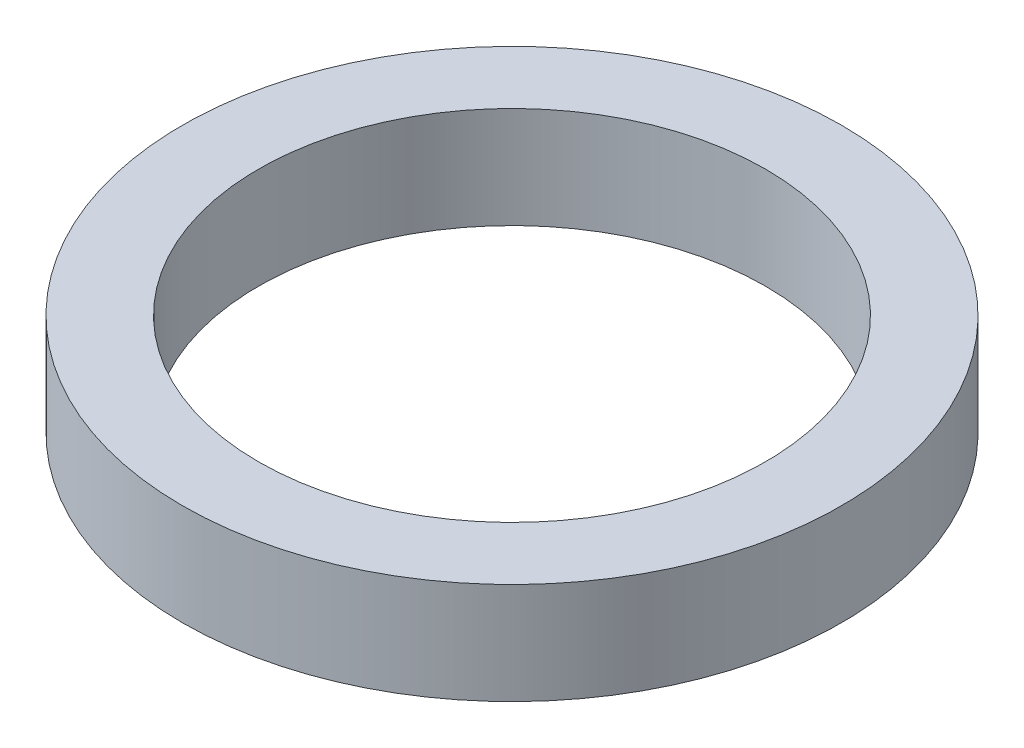
ISO-10303-21;
HEADER;
FILE_DESCRIPTION(('STEP AP214'),'2;1');
FILE_NAME('part.step','',(''),(''),'','','');
FILE_SCHEMA(('AUTOMOTIVE_DESIGN { 1 0 10303 214 1 1 1 1 }'));
ENDSEC;
DATA;
#1=APPLICATION_CONTEXT('core data for automotive mechanical design processes');
#2=APPLICATION_PROTOCOL_DEFINITION('international standard','automotive_design',2000,#1);
#3=PRODUCT_CONTEXT('',#1,'mechanical');
#4=PRODUCT('Part','Part','',(#3));
#5=PRODUCT_RELATED_PRODUCT_CATEGORY('part','',(#4));
#6=PRODUCT_DEFINITION_FORMATION('','',#4);
#7=PRODUCT_DEFINITION_CONTEXT('part definition',#1,'design');
#8=PRODUCT_DEFINITION('design','',#6,#7);
#9=PRODUCT_DEFINITION_SHAPE('','',#8);
#10=(LENGTH_UNIT() NAMED_UNIT(*) SI_UNIT(.MILLI.,.METRE.));
#11=(NAMED_UNIT(*) PLANE_ANGLE_UNIT() SI_UNIT($,.RADIAN.));
#12=(NAMED_UNIT(*) SI_UNIT($,.STERADIAN.) SOLID_ANGLE_UNIT());
#13=UNCERTAINTY_MEASURE_WITH_UNIT(LENGTH_MEASURE(1.E-05),#10,'distance_accuracy_value','');
#14=(GEOMETRIC_REPRESENTATION_CONTEXT(3) GLOBAL_UNCERTAINTY_ASSIGNED_CONTEXT((#13)) GLOBAL_UNIT_ASSIGNED_CONTEXT((#10,
#11,#12)) REPRESENTATION_CONTEXT('',''));
#15=CARTESIAN_POINT('',(0.,0.,0.));
#16=DIRECTION('',(0.,0.,1.));
#17=DIRECTION('',(1.,0.,0.));
#18=AXIS2_PLACEMENT_3D('',#15,#16,#17);
#19=CARTESIAN_POINT('',(0.,2.,0.));
#20=DIRECTION('',(0.,1.,0.));
#21=DIRECTION('',(0.,0.,1.));
#22=AXIS2_PLACEMENT_3D('',#19,#20,#21);
#23=PLANE('',#22);
#24=CARTESIAN_POINT('',(0.,2.,0.));
#25=DIRECTION('',(0.,1.,0.));
#26=DIRECTION('',(0.,0.,1.));
#27=AXIS2_PLACEMENT_3D('',#24,#25,#26);
#28=CIRCLE('',#27,6.5);
#29=CARTESIAN_POINT('',(0.,2.,6.5));
#30=VERTEX_POINT('',#29);
#31=EDGE_CURVE('E10',#30,#30,#28,.T.);
#32=ORIENTED_EDGE('',*,*,#31,.T.);
#33=EDGE_LOOP('',(#32));
#34=FACE_BOUND('',#33,.T.);
#35=CARTESIAN_POINT('',(0.,2.,0.));
#36=DIRECTION('',(0.,1.,0.));
#37=DIRECTION('',(0.,0.,1.));
#38=AXIS2_PLACEMENT_3D('',#35,#36,#37);
#39=CIRCLE('',#38,5.);
#40=CARTESIAN_POINT('',(0.,2.,5.));
#41=VERTEX_POINT('',#40);
#42=EDGE_CURVE('E56',#41,#41,#39,.T.);
#43=ORIENTED_EDGE('',*,*,#42,.F.);
#44=EDGE_LOOP('',(#43));
#45=FACE_BOUND('',#44,.T.);
#46=ADVANCED_FACE('F43',(#34,#45),#23,.T.);
#47=CARTESIAN_POINT('',(0.,0.,0.));
#48=DIRECTION('',(0.,1.,0.));
#49=DIRECTION('',(0.,0.,1.));
#50=AXIS2_PLACEMENT_3D('',#47,#48,#49);
#51=PLANE('',#50);
#52=CARTESIAN_POINT('',(0.,0.,0.));
#53=DIRECTION('',(0.,1.,0.));
#54=DIRECTION('',(0.,0.,1.));
#55=AXIS2_PLACEMENT_3D('',#52,#53,#54);
#56=CIRCLE('',#55,6.5);
#57=CARTESIAN_POINT('',(0.,0.,6.5));
#58=VERTEX_POINT('',#57);
#59=EDGE_CURVE('E47',#58,#58,#56,.T.);
#60=ORIENTED_EDGE('',*,*,#59,.F.);
#61=EDGE_LOOP('',(#60));
#62=FACE_BOUND('',#61,.T.);
#63=CARTESIAN_POINT('',(0.,0.,0.));
#64=DIRECTION('',(0.,1.,0.));
#65=DIRECTION('',(0.,0.,1.));
#66=AXIS2_PLACEMENT_3D('',#63,#64,#65);
#67=CIRCLE('',#66,5.);
#68=CARTESIAN_POINT('',(0.,0.,5.));
#69=VERTEX_POINT('',#68);
#70=EDGE_CURVE('E58',#69,#69,#67,.T.);
#71=ORIENTED_EDGE('',*,*,#70,.T.);
#72=EDGE_LOOP('',(#71));
#73=FACE_BOUND('',#72,.T.);
#74=ADVANCED_FACE('F70',(#62,#73),#51,.F.);
#75=CARTESIAN_POINT('',(0.,2.,0.));
#76=DIRECTION('',(0.,-1.,0.));
#77=DIRECTION('',(0.,0.,-1.));
#78=AXIS2_PLACEMENT_3D('',#75,#76,#77);
#79=CYLINDRICAL_SURFACE('',#78,6.5);
#80=ORIENTED_EDGE('',*,*,#31,.F.);
#81=EDGE_LOOP('',(#80));
#82=FACE_BOUND('',#81,.T.);
#83=ORIENTED_EDGE('',*,*,#59,.T.);
#84=EDGE_LOOP('',(#83));
#85=FACE_BOUND('',#84,.T.);
#86=ADVANCED_FACE('F45',(#82,#85),#79,.T.);
#87=CARTESIAN_POINT('',(0.,2.,0.));
#88=DIRECTION('',(0.,-1.,0.));
#89=DIRECTION('',(0.,0.,-1.));
#90=AXIS2_PLACEMENT_3D('',#87,#88,#89);
#91=CYLINDRICAL_SURFACE('',#90,5.);
#92=ORIENTED_EDGE('',*,*,#42,.T.);
#93=EDGE_LOOP('',(#92));
#94=FACE_BOUND('',#93,.T.);
#95=ORIENTED_EDGE('',*,*,#70,.F.);
#96=EDGE_LOOP('',(#95));
#97=FACE_BOUND('',#96,.T.);
#98=ADVANCED_FACE('F66',(#94,#97),#91,.F.);
#99=CLOSED_SHELL('',(#46,#74,#86,#98));
#100=MANIFOLD_SOLID_BREP('B2',#99);
#101=ADVANCED_BREP_SHAPE_REPRESENTATION('',(#18,#100),#14);
#102=SHAPE_DEFINITION_REPRESENTATION(#9,#101);
ENDSEC;
END-ISO-10303-21;
